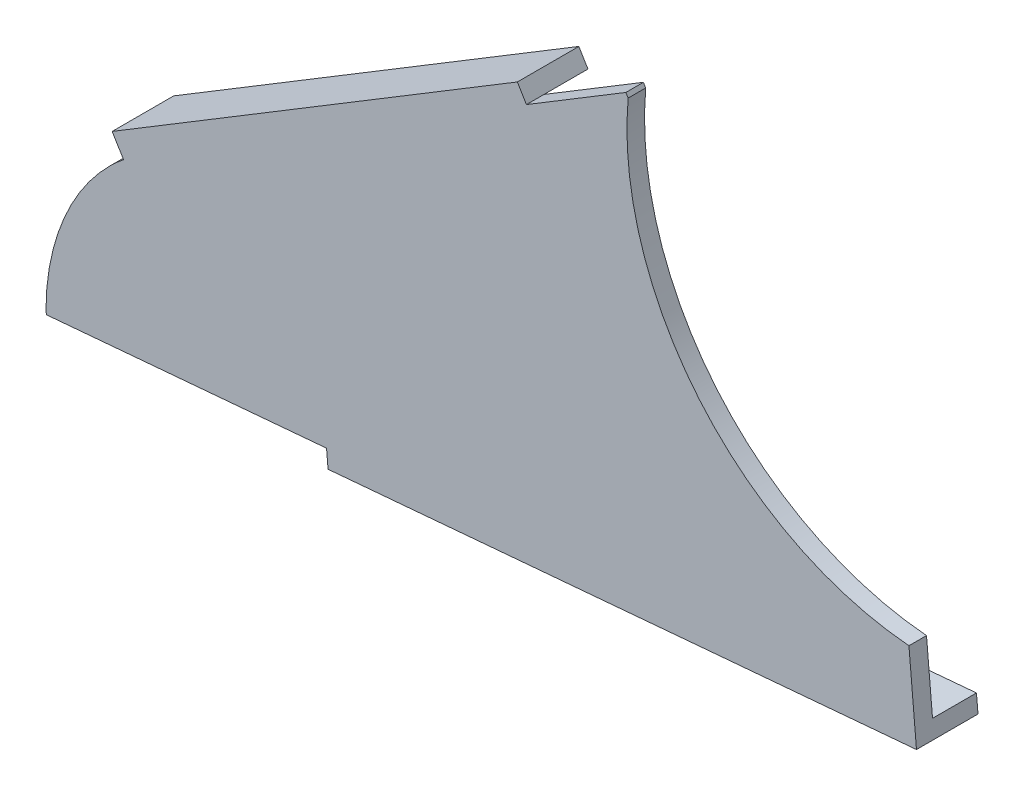
ISO-10303-21;
HEADER;
FILE_DESCRIPTION(('STEP AP214'),'2;1');
FILE_NAME('part.step','',(''),(''),'','','');
FILE_SCHEMA(('AUTOMOTIVE_DESIGN { 1 0 10303 214 1 1 1 1 }'));
ENDSEC;
DATA;
#1=APPLICATION_CONTEXT('core data for automotive mechanical design processes');
#2=APPLICATION_PROTOCOL_DEFINITION('international standard','automotive_design',2000,#1);
#3=PRODUCT_CONTEXT('',#1,'mechanical');
#4=PRODUCT('Part','Part','',(#3));
#5=PRODUCT_RELATED_PRODUCT_CATEGORY('part','',(#4));
#6=PRODUCT_DEFINITION_FORMATION('','',#4);
#7=PRODUCT_DEFINITION_CONTEXT('part definition',#1,'design');
#8=PRODUCT_DEFINITION('design','',#6,#7);
#9=PRODUCT_DEFINITION_SHAPE('','',#8);
#10=(LENGTH_UNIT() NAMED_UNIT(*) SI_UNIT(.MILLI.,.METRE.));
#11=(NAMED_UNIT(*) PLANE_ANGLE_UNIT() SI_UNIT($,.RADIAN.));
#12=(NAMED_UNIT(*) SI_UNIT($,.STERADIAN.) SOLID_ANGLE_UNIT());
#13=UNCERTAINTY_MEASURE_WITH_UNIT(LENGTH_MEASURE(1.E-05),#10,'distance_accuracy_value','');
#14=(GEOMETRIC_REPRESENTATION_CONTEXT(3) GLOBAL_UNCERTAINTY_ASSIGNED_CONTEXT((#13)) GLOBAL_UNIT_ASSIGNED_CONTEXT((#10,
#11,#12)) REPRESENTATION_CONTEXT('',''));
#15=CARTESIAN_POINT('',(0.,0.,0.));
#16=DIRECTION('',(0.,0.,1.));
#17=DIRECTION('',(1.,0.,0.));
#18=AXIS2_PLACEMENT_3D('',#15,#16,#17);
#19=CARTESIAN_POINT('',(0.,0.,40.5));
#20=DIRECTION('',(0.,0.,-1.));
#21=DIRECTION('',(-1.,0.,0.));
#22=AXIS2_PLACEMENT_3D('',#19,#20,#21);
#23=PLANE('',#22);
#24=DIRECTION('',(-0.0871557427476548,0.996194698091746,0.));
#25=VECTOR('',#24,1.);
#26=CARTESIAN_POINT('',(-5.96376748008358,-0.518108895310425,40.5));
#27=LINE('',#26,#25);
#28=CARTESIAN_POINT('',(-2.27259738836021,-42.7083761020985,40.5));
#29=VERTEX_POINT('',#28);
#30=CARTESIAN_POINT('',(-2.9561107878706,-34.8957821960562,40.5));
#31=VERTEX_POINT('',#30);
#32=EDGE_CURVE('E46',#29,#31,#27,.T.);
#33=ORIENTED_EDGE('',*,*,#32,.F.);
#34=DIRECTION('',(0.996194698091746,0.0871557427476548,0.));
#35=VECTOR('',#34,1.);
#36=CARTESIAN_POINT('',(-101.091066182006,-51.3538718685325,40.5));
#37=LINE('',#36,#35);
#38=CARTESIAN_POINT('',(-69.2168811001255,-48.5652420147409,40.5));
#39=VERTEX_POINT('',#38);
#40=EDGE_CURVE('E231',#39,#29,#37,.T.);
#41=ORIENTED_EDGE('',*,*,#40,.F.);
#42=CARTESIAN_POINT('',(-101.091066182006,-51.3538718685325,40.5));
#43=VERTEX_POINT('',#42);
#44=EDGE_CURVE('E232',#43,#39,#37,.T.);
#45=ORIENTED_EDGE('',*,*,#44,.F.);
#46=DIRECTION('',(-0.0871557427476548,0.996194698091746,0.));
#47=VECTOR('',#46,1.);
#48=CARTESIAN_POINT('',(-101.091066182006,-51.3538718685325,40.5));
#49=LINE('',#48,#47);
#50=CARTESIAN_POINT('',(-101.13464405338,-50.8557745194866,40.5));
#51=VERTEX_POINT('',#50);
#52=EDGE_CURVE('E235',#43,#51,#49,.T.);
#53=ORIENTED_EDGE('',*,*,#52,.T.);
#54=CARTESIAN_POINT('',(-101.13464405338,-50.8557745194866,40.5));
#55=CARTESIAN_POINT('',(-101.13464405338,-43.6373707117498,40.5));
#56=CARTESIAN_POINT('',(-97.9546061806146,-36.2754669599375,40.5));
#57=CARTESIAN_POINT('',(-92.3119086872845,-31.684810245305,40.5));
#58=B_SPLINE_CURVE_WITH_KNOTS('',3,(#54,#55,#56,#57),.UNSPECIFIED.,.F.,.F.,(4,4),(0.,1.),.UNSPECIFIED.);
#59=CARTESIAN_POINT('',(-92.3119086872844,-31.684810245305,40.5));
#60=VERTEX_POINT('',#59);
#61=EDGE_CURVE('E241',#51,#60,#58,.T.);
#62=ORIENTED_EDGE('',*,*,#61,.T.);
#63=DIRECTION('',(0.518069982463939,-0.855338233256186,0.));
#64=VECTOR('',#63,1.);
#65=CARTESIAN_POINT('',(-92.5709436785164,-31.2571411286769,40.5));
#66=LINE('',#65,#64);
#67=CARTESIAN_POINT('',(-92.5709436785164,-31.2571411286769,40.5));
#68=VERTEX_POINT('',#67);
#69=EDGE_CURVE('E195',#68,#60,#66,.T.);
#70=ORIENTED_EDGE('',*,*,#69,.F.);
#71=DIRECTION('',(-0.855338233256186,-0.518069982463939,0.));
#72=VECTOR('',#71,1.);
#73=CARTESIAN_POINT('',(-35.1646172513039,3.5133079979173,40.5));
#74=LINE('',#73,#72);
#75=CARTESIAN_POINT('',(-46.4721886949507,-3.33557717025598,40.5));
#76=VERTEX_POINT('',#75);
#77=EDGE_CURVE('E62',#76,#68,#74,.T.);
#78=ORIENTED_EDGE('',*,*,#77,.F.);
#79=CARTESIAN_POINT('',(-35.1646172513039,3.5133079979173,40.5));
#80=VERTEX_POINT('',#79);
#81=EDGE_CURVE('E188',#80,#76,#74,.T.);
#82=ORIENTED_EDGE('',*,*,#81,.F.);
#83=DIRECTION('',(0.518069982463939,-0.855338233256186,0.));
#84=VECTOR('',#83,1.);
#85=CARTESIAN_POINT('',(-35.1646172513039,3.5133079979173,40.5));
#86=LINE('',#85,#84);
#87=CARTESIAN_POINT('',(-34.905582260072,3.0856388812892,40.5));
#88=VERTEX_POINT('',#87);
#89=EDGE_CURVE('E197',#80,#88,#86,.T.);
#90=ORIENTED_EDGE('',*,*,#89,.T.);
#91=CARTESIAN_POINT('',(-0.0207697284744204,0.00183603531541141,40.5));
#92=DIRECTION('',(0.,0.,1.));
#93=DIRECTION('',(-1.,0.,0.));
#94=AXIS2_PLACEMENT_3D('',#91,#92,#93);
#95=CIRCLE('',#94,35.0208507229271);
#96=EDGE_CURVE('E249',#88,#31,#95,.T.);
#97=ORIENTED_EDGE('',*,*,#96,.T.);
#98=EDGE_LOOP('',(#33,#41,#45,#53,#62,#70,#78,#82,#90,#97));
#99=FACE_BOUND('',#98,.T.);
#100=ADVANCED_FACE('F35',(#99),#23,.T.);
#101=CARTESIAN_POINT('',(-101.13464405338,-50.8557745194866,-12.5));
#102=CARTESIAN_POINT('',(-101.13464405338,-43.6373707117498,-12.5));
#103=CARTESIAN_POINT('',(-97.9546061806146,-36.2754669599375,-12.5));
#104=CARTESIAN_POINT('',(-92.3119086872845,-31.684810245305,-12.5));
#105=B_SPLINE_CURVE_WITH_KNOTS('',3,(#101,#102,#103,#104),.UNSPECIFIED.,.F.,.F.,(4,4),(0.,1.),.UNSPECIFIED.);
#106=DIRECTION('',(0.,0.,1.));
#107=VECTOR('',#106,1.);
#108=SURFACE_OF_LINEAR_EXTRUSION('',#105,#107);
#109=ORIENTED_EDGE('',*,*,#61,.F.);
#110=DIRECTION('',(0.,0.,1.));
#111=VECTOR('',#110,1.);
#112=CARTESIAN_POINT('',(-101.13464405338,-50.8557745194866,0.));
#113=LINE('',#112,#111);
#114=CARTESIAN_POINT('',(-101.13464405338,-50.8557745194866,42.5));
#115=VERTEX_POINT('',#114);
#116=EDGE_CURVE('E246',#51,#115,#113,.T.);
#117=ORIENTED_EDGE('',*,*,#116,.T.);
#118=CARTESIAN_POINT('',(-101.13464405338,-50.8557745194866,42.5));
#119=CARTESIAN_POINT('',(-101.13464405338,-43.6373707117498,42.5));
#120=CARTESIAN_POINT('',(-97.9546061806146,-36.2754669599375,42.5));
#121=CARTESIAN_POINT('',(-92.3119086872845,-31.684810245305,42.5));
#122=B_SPLINE_CURVE_WITH_KNOTS('',3,(#118,#119,#120,#121),.UNSPECIFIED.,.F.,.F.,(4,4),(0.,1.),.UNSPECIFIED.);
#123=CARTESIAN_POINT('',(-92.3119086872845,-31.684810245305,42.5));
#124=VERTEX_POINT('',#123);
#125=EDGE_CURVE('E253',#115,#124,#122,.T.);
#126=ORIENTED_EDGE('',*,*,#125,.T.);
#127=DIRECTION('',(0.,0.,1.));
#128=VECTOR('',#127,1.);
#129=CARTESIAN_POINT('',(-92.3119086872845,-31.684810245305,-12.5));
#130=LINE('',#129,#128);
#131=EDGE_CURVE('E252',#60,#124,#130,.T.);
#132=ORIENTED_EDGE('',*,*,#131,.F.);
#133=EDGE_LOOP('',(#109,#117,#126,#132));
#134=FACE_BOUND('',#133,.T.);
#135=ADVANCED_FACE('F274',(#134),#108,.F.);
#136=CARTESIAN_POINT('',(-7.10974111085505,12.5804296419934,42.5));
#137=DIRECTION('',(-0.996194698091746,-0.0871557427476548,0.));
#138=DIRECTION('',(0.0871557427476548,-0.996194698091746,0.));
#139=AXIS2_PLACEMENT_3D('',#136,#137,#138);
#140=PLANE('',#139);
#141=DIRECTION('',(0.0871557427476548,-0.996194698091746,0.));
#142=VECTOR('',#141,1.);
#143=CARTESIAN_POINT('',(-7.10974111085505,12.5804296419934,42.5));
#144=LINE('',#143,#142);
#145=CARTESIAN_POINT('',(-2.9561107878706,-34.8957821960563,42.5));
#146=VERTEX_POINT('',#145);
#147=CARTESIAN_POINT('',(-2.0982859028649,-44.700765498282,42.5));
#148=VERTEX_POINT('',#147);
#149=EDGE_CURVE('E11',#146,#148,#144,.T.);
#150=ORIENTED_EDGE('',*,*,#149,.T.);
#151=DIRECTION('',(0.,0.,-1.));
#152=VECTOR('',#151,1.);
#153=CARTESIAN_POINT('',(-2.0982859028649,-44.700765498282,110.076006319972));
#154=LINE('',#153,#152);
#155=CARTESIAN_POINT('',(-2.0982859028649,-44.700765498282,35.5));
#156=VERTEX_POINT('',#155);
#157=EDGE_CURVE('E221',#148,#156,#154,.T.);
#158=ORIENTED_EDGE('',*,*,#157,.T.);
#159=DIRECTION('',(0.0871557427476546,-0.996194698091746,0.));
#160=VECTOR('',#159,1.);
#161=CARTESIAN_POINT('',(-2.27259738836021,-42.7083761020985,35.5));
#162=LINE('',#161,#160);
#163=CARTESIAN_POINT('',(-2.27259738836021,-42.7083761020985,35.5));
#164=VERTEX_POINT('',#163);
#165=EDGE_CURVE('E199',#164,#156,#162,.T.);
#166=ORIENTED_EDGE('',*,*,#165,.F.);
#167=DIRECTION('',(0.,0.,-1.));
#168=VECTOR('',#167,1.);
#169=CARTESIAN_POINT('',(-2.27259738836021,-42.7083761020985,110.076006319972));
#170=LINE('',#169,#168);
#171=EDGE_CURVE('E219',#29,#164,#170,.T.);
#172=ORIENTED_EDGE('',*,*,#171,.F.);
#173=ORIENTED_EDGE('',*,*,#32,.T.);
#174=DIRECTION('',(0.,0.,-1.));
#175=VECTOR('',#174,1.);
#176=CARTESIAN_POINT('',(-2.9561107878706,-34.8957821960562,42.));
#177=LINE('',#176,#175);
#178=EDGE_CURVE('E258',#31,#146,#177,.F.);
#179=ORIENTED_EDGE('',*,*,#178,.T.);
#180=EDGE_LOOP('',(#150,#158,#166,#172,#173,#179));
#181=FACE_BOUND('',#180,.T.);
#182=ADVANCED_FACE('F37',(#181),#140,.F.);
#183=CARTESIAN_POINT('',(-0.0207697284744204,0.00183603531541141,42.));
#184=DIRECTION('',(0.,0.,-1.));
#185=DIRECTION('',(-1.,0.,0.));
#186=AXIS2_PLACEMENT_3D('',#183,#184,#185);
#187=CYLINDRICAL_SURFACE('',#186,35.0208507229271);
#188=ORIENTED_EDGE('',*,*,#178,.F.);
#189=ORIENTED_EDGE('',*,*,#96,.F.);
#190=DIRECTION('',(0.,0.,-1.));
#191=VECTOR('',#190,1.);
#192=CARTESIAN_POINT('',(-34.905582260072,3.0856388812892,42.));
#193=LINE('',#192,#191);
#194=CARTESIAN_POINT('',(-34.905582260072,3.0856388812892,42.5));
#195=VERTEX_POINT('',#194);
#196=EDGE_CURVE('E242',#195,#88,#193,.T.);
#197=ORIENTED_EDGE('',*,*,#196,.F.);
#198=CARTESIAN_POINT('',(-0.0207697284744204,0.00183603531541141,42.5));
#199=DIRECTION('',(0.,0.,-1.));
#200=DIRECTION('',(1.,0.,0.));
#201=AXIS2_PLACEMENT_3D('',#198,#199,#200);
#202=CIRCLE('',#201,35.0208507229271);
#203=EDGE_CURVE('E245',#146,#195,#202,.T.);
#204=ORIENTED_EDGE('',*,*,#203,.F.);
#205=EDGE_LOOP('',(#188,#189,#197,#204));
#206=FACE_BOUND('',#205,.T.);
#207=ADVANCED_FACE('F301',(#206),#187,.F.);
#208=CARTESIAN_POINT('',(-0.0207697284744204,0.00183603531541141,42.5));
#209=DIRECTION('',(0.,0.,1.));
#210=DIRECTION('',(1.,0.,0.));
#211=AXIS2_PLACEMENT_3D('',#208,#209,#210);
#212=PLANE('',#211);
#213=ORIENTED_EDGE('',*,*,#149,.F.);
#214=ORIENTED_EDGE('',*,*,#203,.T.);
#215=DIRECTION('',(0.518069982463939,-0.855338233256186,0.));
#216=VECTOR('',#215,1.);
#217=CARTESIAN_POINT('',(-35.1646172513039,3.5133079979173,42.5));
#218=LINE('',#217,#216);
#219=CARTESIAN_POINT('',(-35.1646172513039,3.5133079979173,42.5));
#220=VERTEX_POINT('',#219);
#221=EDGE_CURVE('E192',#220,#195,#218,.T.);
#222=ORIENTED_EDGE('',*,*,#221,.F.);
#223=DIRECTION('',(0.855338233256186,0.518069982463939,0.));
#224=VECTOR('',#223,1.);
#225=CARTESIAN_POINT('',(-92.5709436785164,-31.2571411286769,42.5));
#226=LINE('',#225,#224);
#227=CARTESIAN_POINT('',(-46.4721886949507,-3.335577170256,42.5));
#228=VERTEX_POINT('',#227);
#229=EDGE_CURVE('E190',#228,#220,#226,.T.);
#230=ORIENTED_EDGE('',*,*,#229,.F.);
#231=DIRECTION('',(0.51806998246394,-0.855338233256186,0.));
#232=VECTOR('',#231,1.);
#233=CARTESIAN_POINT('',(-46.4721886949507,-3.33557717025598,42.5));
#234=LINE('',#233,#232);
#235=CARTESIAN_POINT('',(-47.5083286598786,-1.62490070374361,42.5));
#236=VERTEX_POINT('',#235);
#237=EDGE_CURVE('E179',#236,#228,#234,.T.);
#238=ORIENTED_EDGE('',*,*,#237,.F.);
#239=DIRECTION('',(0.855338233256186,0.518069982463939,0.));
#240=VECTOR('',#239,1.);
#241=CARTESIAN_POINT('',(-93.6070836434443,-29.5464646621645,42.5));
#242=LINE('',#241,#240);
#243=CARTESIAN_POINT('',(-93.6070836434443,-29.5464646621645,42.5));
#244=VERTEX_POINT('',#243);
#245=EDGE_CURVE('E177',#244,#236,#242,.T.);
#246=ORIENTED_EDGE('',*,*,#245,.F.);
#247=DIRECTION('',(0.518069982463939,-0.855338233256186,0.));
#248=VECTOR('',#247,1.);
#249=CARTESIAN_POINT('',(-92.5709436785164,-31.2571411286769,42.5));
#250=LINE('',#249,#248);
#251=EDGE_CURVE('E152',#244,#124,#250,.T.);
#252=ORIENTED_EDGE('',*,*,#251,.T.);
#253=ORIENTED_EDGE('',*,*,#125,.F.);
#254=DIRECTION('',(-0.0871557427476548,0.996194698091746,0.));
#255=VECTOR('',#254,1.);
#256=CARTESIAN_POINT('',(-101.091066182006,-51.3538718685325,42.5));
#257=LINE('',#256,#255);
#258=CARTESIAN_POINT('',(-101.091066182006,-51.3538718685325,42.5));
#259=VERTEX_POINT('',#258);
#260=EDGE_CURVE('E238',#259,#115,#257,.T.);
#261=ORIENTED_EDGE('',*,*,#260,.F.);
#262=DIRECTION('',(-0.996194698091746,-0.0871557427476548,0.));
#263=VECTOR('',#262,1.);
#264=CARTESIAN_POINT('',(-2.27259738836021,-42.7083761020985,42.5));
#265=LINE('',#264,#263);
#266=CARTESIAN_POINT('',(-69.2168811001255,-48.5652420147409,42.5));
#267=VERTEX_POINT('',#266);
#268=EDGE_CURVE('E227',#267,#259,#265,.T.);
#269=ORIENTED_EDGE('',*,*,#268,.F.);
#270=DIRECTION('',(-0.0871557427476673,0.996194698091745,0.));
#271=VECTOR('',#270,1.);
#272=CARTESIAN_POINT('',(-69.2168811001255,-48.5652420147409,42.5));
#273=LINE('',#272,#271);
#274=CARTESIAN_POINT('',(-69.0425696146302,-50.5576314109244,42.5));
#275=VERTEX_POINT('',#274);
#276=EDGE_CURVE('E215',#275,#267,#273,.T.);
#277=ORIENTED_EDGE('',*,*,#276,.F.);
#278=DIRECTION('',(-0.996194698091746,-0.0871557427476547,0.));
#279=VECTOR('',#278,1.);
#280=CARTESIAN_POINT('',(-2.0982859028649,-44.700765498282,42.5));
#281=LINE('',#280,#279);
#282=EDGE_CURVE('E211',#148,#275,#281,.T.);
#283=ORIENTED_EDGE('',*,*,#282,.F.);
#284=EDGE_LOOP('',(#213,#214,#222,#230,#238,#246,#252,#253,#261,#269,#277,#283));
#285=FACE_BOUND('',#284,.T.);
#286=ADVANCED_FACE('F279',(#285),#212,.T.);
#287=CARTESIAN_POINT('',(-101.091066182006,-51.3538718685325,42.5));
#288=DIRECTION('',(0.996194698091746,0.0871557427476548,0.));
#289=DIRECTION('',(-0.0871557427476548,0.996194698091746,0.));
#290=AXIS2_PLACEMENT_3D('',#287,#288,#289);
#291=PLANE('',#290);
#292=ORIENTED_EDGE('',*,*,#116,.F.);
#293=ORIENTED_EDGE('',*,*,#52,.F.);
#294=DIRECTION('',(0.,0.,-1.));
#295=VECTOR('',#294,1.);
#296=CARTESIAN_POINT('',(-101.091066182006,-51.3538718685325,42.5));
#297=LINE('',#296,#295);
#298=EDGE_CURVE('E229',#259,#43,#297,.T.);
#299=ORIENTED_EDGE('',*,*,#298,.F.);
#300=ORIENTED_EDGE('',*,*,#260,.T.);
#301=EDGE_LOOP('',(#292,#293,#299,#300));
#302=FACE_BOUND('',#301,.T.);
#303=ADVANCED_FACE('F305',(#302),#291,.F.);
#304=CARTESIAN_POINT('',(3.69085291020762,-42.1866418054736,0.));
#305=DIRECTION('',(0.0871557427476548,-0.996194698091746,0.));
#306=DIRECTION('',(0.996194698091746,0.0871557427476548,0.));
#307=AXIS2_PLACEMENT_3D('',#304,#305,#306);
#308=PLANE('',#307);
#309=DIRECTION('',(0.,0.,-1.));
#310=VECTOR('',#309,1.);
#311=CARTESIAN_POINT('',(-69.2168811001255,-48.5652420147409,110.076006319972));
#312=LINE('',#311,#310);
#313=EDGE_CURVE('E222',#267,#39,#312,.T.);
#314=ORIENTED_EDGE('',*,*,#313,.F.);
#315=ORIENTED_EDGE('',*,*,#268,.T.);
#316=ORIENTED_EDGE('',*,*,#298,.T.);
#317=ORIENTED_EDGE('',*,*,#44,.T.);
#318=EDGE_LOOP('',(#314,#315,#316,#317));
#319=FACE_BOUND('',#318,.T.);
#320=ADVANCED_FACE('F313',(#319),#308,.T.);
#321=CARTESIAN_POINT('',(-2.0982859028649,-44.700765498282,110.076006319972));
#322=DIRECTION('',(0.0871557427476547,-0.996194698091746,0.));
#323=DIRECTION('',(0.996194698091746,0.0871557427476547,0.));
#324=AXIS2_PLACEMENT_3D('',#321,#322,#323);
#325=PLANE('',#324);
#326=ORIENTED_EDGE('',*,*,#157,.F.);
#327=ORIENTED_EDGE('',*,*,#282,.T.);
#328=DIRECTION('',(0.,0.,-1.));
#329=VECTOR('',#328,1.);
#330=CARTESIAN_POINT('',(-69.0425696146302,-50.5576314109244,110.076006319972));
#331=LINE('',#330,#329);
#332=CARTESIAN_POINT('',(-69.0425696146302,-50.5576314109244,35.5));
#333=VERTEX_POINT('',#332);
#334=EDGE_CURVE('E214',#275,#333,#331,.T.);
#335=ORIENTED_EDGE('',*,*,#334,.T.);
#336=DIRECTION('',(-0.996194698091746,-0.0871557427476547,0.));
#337=VECTOR('',#336,1.);
#338=CARTESIAN_POINT('',(-2.0982859028649,-44.700765498282,35.5));
#339=LINE('',#338,#337);
#340=EDGE_CURVE('E202',#156,#333,#339,.T.);
#341=ORIENTED_EDGE('',*,*,#340,.F.);
#342=EDGE_LOOP('',(#326,#327,#335,#341));
#343=FACE_BOUND('',#342,.T.);
#344=ADVANCED_FACE('F317',(#343),#325,.T.);
#345=CARTESIAN_POINT('',(-69.2168811001255,-48.5652420147409,110.076006319972));
#346=DIRECTION('',(-0.996194698091745,-0.0871557427476673,0.));
#347=DIRECTION('',(0.0871557427476673,-0.996194698091745,0.));
#348=AXIS2_PLACEMENT_3D('',#345,#346,#347);
#349=PLANE('',#348);
#350=ORIENTED_EDGE('',*,*,#334,.F.);
#351=ORIENTED_EDGE('',*,*,#276,.T.);
#352=ORIENTED_EDGE('',*,*,#313,.T.);
#353=CARTESIAN_POINT('',(-69.2168811001255,-48.5652420147409,35.5));
#354=VERTEX_POINT('',#353);
#355=EDGE_CURVE('E218',#39,#354,#312,.T.);
#356=ORIENTED_EDGE('',*,*,#355,.T.);
#357=DIRECTION('',(-0.0871557427476673,0.996194698091745,0.));
#358=VECTOR('',#357,1.);
#359=CARTESIAN_POINT('',(-69.2168811001255,-48.5652420147409,35.5));
#360=LINE('',#359,#358);
#361=EDGE_CURVE('E205',#333,#354,#360,.T.);
#362=ORIENTED_EDGE('',*,*,#361,.F.);
#363=EDGE_LOOP('',(#350,#351,#352,#356,#362));
#364=FACE_BOUND('',#363,.T.);
#365=ADVANCED_FACE('F321',(#364),#349,.T.);
#366=CARTESIAN_POINT('',(-2.27259738836021,-42.7083761020985,110.076006319972));
#367=DIRECTION('',(-0.0871557427476547,0.996194698091746,0.));
#368=DIRECTION('',(-0.996194698091746,-0.0871557427476547,0.));
#369=AXIS2_PLACEMENT_3D('',#366,#367,#368);
#370=PLANE('',#369);
#371=ORIENTED_EDGE('',*,*,#355,.F.);
#372=ORIENTED_EDGE('',*,*,#40,.T.);
#373=ORIENTED_EDGE('',*,*,#171,.T.);
#374=DIRECTION('',(0.996194698091746,0.0871557427476547,0.));
#375=VECTOR('',#374,1.);
#376=CARTESIAN_POINT('',(-2.27259738836021,-42.7083761020985,35.5));
#377=LINE('',#376,#375);
#378=EDGE_CURVE('E208',#354,#164,#377,.T.);
#379=ORIENTED_EDGE('',*,*,#378,.F.);
#380=EDGE_LOOP('',(#371,#372,#373,#379));
#381=FACE_BOUND('',#380,.T.);
#382=ADVANCED_FACE('F325',(#381),#370,.T.);
#383=CARTESIAN_POINT('',(0.,0.,35.5));
#384=DIRECTION('',(0.,0.,-1.));
#385=DIRECTION('',(-1.,0.,0.));
#386=AXIS2_PLACEMENT_3D('',#383,#384,#385);
#387=PLANE('',#386);
#388=ORIENTED_EDGE('',*,*,#165,.T.);
#389=ORIENTED_EDGE('',*,*,#340,.T.);
#390=ORIENTED_EDGE('',*,*,#361,.T.);
#391=ORIENTED_EDGE('',*,*,#378,.T.);
#392=EDGE_LOOP('',(#388,#389,#390,#391));
#393=FACE_BOUND('',#392,.T.);
#394=ADVANCED_FACE('F329',(#393),#387,.T.);
#395=CARTESIAN_POINT('',(-35.1646172513039,3.5133079979173,42.5));
#396=DIRECTION('',(-0.855338233256186,-0.518069982463939,0.));
#397=DIRECTION('',(0.518069982463939,-0.855338233256186,0.));
#398=AXIS2_PLACEMENT_3D('',#395,#396,#397);
#399=PLANE('',#398);
#400=ORIENTED_EDGE('',*,*,#196,.T.);
#401=ORIENTED_EDGE('',*,*,#89,.F.);
#402=DIRECTION('',(0.,0.,-1.));
#403=VECTOR('',#402,1.);
#404=CARTESIAN_POINT('',(-35.1646172513039,3.5133079979173,42.5));
#405=LINE('',#404,#403);
#406=EDGE_CURVE('E156',#220,#80,#405,.T.);
#407=ORIENTED_EDGE('',*,*,#406,.F.);
#408=ORIENTED_EDGE('',*,*,#221,.T.);
#409=EDGE_LOOP('',(#400,#401,#407,#408));
#410=FACE_BOUND('',#409,.T.);
#411=ADVANCED_FACE('F333',(#410),#399,.F.);
#412=CARTESIAN_POINT('',(-92.5709436785164,-31.2571411286769,40.5));
#413=DIRECTION('',(0.855338233256186,0.518069982463939,0.));
#414=DIRECTION('',(-0.518069982463939,0.855338233256186,0.));
#415=AXIS2_PLACEMENT_3D('',#412,#413,#414);
#416=PLANE('',#415);
#417=ORIENTED_EDGE('',*,*,#131,.T.);
#418=ORIENTED_EDGE('',*,*,#251,.F.);
#419=DIRECTION('',(0.,0.,-1.));
#420=VECTOR('',#419,1.);
#421=CARTESIAN_POINT('',(-93.6070836434443,-29.5464646621645,98.1755601175828));
#422=LINE('',#421,#420);
#423=CARTESIAN_POINT('',(-93.6070836434443,-29.5464646621645,35.5));
#424=VERTEX_POINT('',#423);
#425=EDGE_CURVE('E145',#244,#424,#422,.T.);
#426=ORIENTED_EDGE('',*,*,#425,.T.);
#427=DIRECTION('',(-0.51806998246394,0.855338233256186,0.));
#428=VECTOR('',#427,1.);
#429=CARTESIAN_POINT('',(-92.5709436785164,-31.2571411286769,35.5));
#430=LINE('',#429,#428);
#431=CARTESIAN_POINT('',(-92.5709436785164,-31.2571411286769,35.5));
#432=VERTEX_POINT('',#431);
#433=EDGE_CURVE('E151',#432,#424,#430,.T.);
#434=ORIENTED_EDGE('',*,*,#433,.F.);
#435=DIRECTION('',(0.,0.,-1.));
#436=VECTOR('',#435,1.);
#437=CARTESIAN_POINT('',(-92.5709436785164,-31.2571411286769,98.1755601175828));
#438=LINE('',#437,#436);
#439=EDGE_CURVE('E157',#68,#432,#438,.T.);
#440=ORIENTED_EDGE('',*,*,#439,.F.);
#441=ORIENTED_EDGE('',*,*,#69,.T.);
#442=EDGE_LOOP('',(#417,#418,#426,#434,#440,#441));
#443=FACE_BOUND('',#442,.T.);
#444=ADVANCED_FACE('F148',(#443),#416,.F.);
#445=CARTESIAN_POINT('',(-10.9948952604394,18.1526716567788,0.));
#446=DIRECTION('',(-0.518069982463939,0.855338233256186,0.));
#447=DIRECTION('',(-0.855338233256186,-0.518069982463939,0.));
#448=AXIS2_PLACEMENT_3D('',#445,#446,#447);
#449=PLANE('',#448);
#450=DIRECTION('',(0.,0.,-1.));
#451=VECTOR('',#450,1.);
#452=CARTESIAN_POINT('',(-46.4721886949507,-3.33557717025598,98.1755601175828));
#453=LINE('',#452,#451);
#454=EDGE_CURVE('E54',#228,#76,#453,.T.);
#455=ORIENTED_EDGE('',*,*,#454,.F.);
#456=ORIENTED_EDGE('',*,*,#229,.T.);
#457=ORIENTED_EDGE('',*,*,#406,.T.);
#458=ORIENTED_EDGE('',*,*,#81,.T.);
#459=EDGE_LOOP('',(#455,#456,#457,#458));
#460=FACE_BOUND('',#459,.T.);
#461=ADVANCED_FACE('F340',(#460),#449,.T.);
#462=CARTESIAN_POINT('',(-93.6070836434443,-29.5464646621645,98.1755601175828));
#463=DIRECTION('',(-0.518069982463939,0.855338233256186,0.));
#464=DIRECTION('',(-0.855338233256186,-0.518069982463939,0.));
#465=AXIS2_PLACEMENT_3D('',#462,#463,#464);
#466=PLANE('',#465);
#467=ORIENTED_EDGE('',*,*,#425,.F.);
#468=ORIENTED_EDGE('',*,*,#245,.T.);
#469=DIRECTION('',(0.,0.,-1.));
#470=VECTOR('',#469,1.);
#471=CARTESIAN_POINT('',(-47.5083286598786,-1.62490070374361,98.1755601175828));
#472=LINE('',#471,#470);
#473=CARTESIAN_POINT('',(-47.5083286598786,-1.62490070374361,35.5));
#474=VERTEX_POINT('',#473);
#475=EDGE_CURVE('E163',#236,#474,#472,.T.);
#476=ORIENTED_EDGE('',*,*,#475,.T.);
#477=DIRECTION('',(0.855338233256186,0.518069982463939,0.));
#478=VECTOR('',#477,1.);
#479=CARTESIAN_POINT('',(-93.6070836434443,-29.5464646621645,35.5));
#480=LINE('',#479,#478);
#481=EDGE_CURVE('E160',#424,#474,#480,.T.);
#482=ORIENTED_EDGE('',*,*,#481,.F.);
#483=EDGE_LOOP('',(#467,#468,#476,#482));
#484=FACE_BOUND('',#483,.T.);
#485=ADVANCED_FACE('F161',(#484),#466,.T.);
#486=CARTESIAN_POINT('',(-46.4721886949507,-3.33557717025598,98.1755601175828));
#487=DIRECTION('',(0.855338233256186,0.51806998246394,0.));
#488=DIRECTION('',(-0.51806998246394,0.855338233256186,0.));
#489=AXIS2_PLACEMENT_3D('',#486,#487,#488);
#490=PLANE('',#489);
#491=ORIENTED_EDGE('',*,*,#475,.F.);
#492=ORIENTED_EDGE('',*,*,#237,.T.);
#493=ORIENTED_EDGE('',*,*,#454,.T.);
#494=CARTESIAN_POINT('',(-46.4721886949507,-3.33557717025598,35.5));
#495=VERTEX_POINT('',#494);
#496=EDGE_CURVE('E182',#76,#495,#453,.T.);
#497=ORIENTED_EDGE('',*,*,#496,.T.);
#498=DIRECTION('',(0.51806998246394,-0.855338233256186,0.));
#499=VECTOR('',#498,1.);
#500=CARTESIAN_POINT('',(-46.4721886949507,-3.33557717025598,35.5));
#501=LINE('',#500,#499);
#502=EDGE_CURVE('E167',#474,#495,#501,.T.);
#503=ORIENTED_EDGE('',*,*,#502,.F.);
#504=EDGE_LOOP('',(#491,#492,#493,#497,#503));
#505=FACE_BOUND('',#504,.T.);
#506=ADVANCED_FACE('F283',(#505),#490,.T.);
#507=CARTESIAN_POINT('',(-92.5709436785164,-31.2571411286769,98.1755601175828));
#508=DIRECTION('',(0.518069982463939,-0.855338233256186,0.));
#509=DIRECTION('',(0.855338233256186,0.518069982463939,0.));
#510=AXIS2_PLACEMENT_3D('',#507,#508,#509);
#511=PLANE('',#510);
#512=ORIENTED_EDGE('',*,*,#496,.F.);
#513=ORIENTED_EDGE('',*,*,#77,.T.);
#514=ORIENTED_EDGE('',*,*,#439,.T.);
#515=DIRECTION('',(-0.855338233256186,-0.518069982463939,0.));
#516=VECTOR('',#515,1.);
#517=CARTESIAN_POINT('',(-92.5709436785164,-31.2571411286769,35.5));
#518=LINE('',#517,#516);
#519=EDGE_CURVE('E172',#495,#432,#518,.T.);
#520=ORIENTED_EDGE('',*,*,#519,.F.);
#521=EDGE_LOOP('',(#512,#513,#514,#520));
#522=FACE_BOUND('',#521,.T.);
#523=ADVANCED_FACE('F286',(#522),#511,.T.);
#524=CARTESIAN_POINT('',(0.,0.,35.5));
#525=DIRECTION('',(0.,0.,-1.));
#526=DIRECTION('',(-1.,0.,0.));
#527=AXIS2_PLACEMENT_3D('',#524,#525,#526);
#528=PLANE('',#527);
#529=ORIENTED_EDGE('',*,*,#433,.T.);
#530=ORIENTED_EDGE('',*,*,#481,.T.);
#531=ORIENTED_EDGE('',*,*,#502,.T.);
#532=ORIENTED_EDGE('',*,*,#519,.T.);
#533=EDGE_LOOP('',(#529,#530,#531,#532));
#534=FACE_BOUND('',#533,.T.);
#535=ADVANCED_FACE('F170',(#534),#528,.T.);
#536=CLOSED_SHELL('',(#100,#135,#182,#207,#286,#303,#320,#344,#365,#382,#394,#411,#444,#461,
#485,#506,#523,#535));
#537=MANIFOLD_SOLID_BREP('B2',#536);
#538=ADVANCED_BREP_SHAPE_REPRESENTATION('',(#18,#537),#14);
#539=SHAPE_DEFINITION_REPRESENTATION(#9,#538);
ENDSEC;
END-ISO-10303-21;
